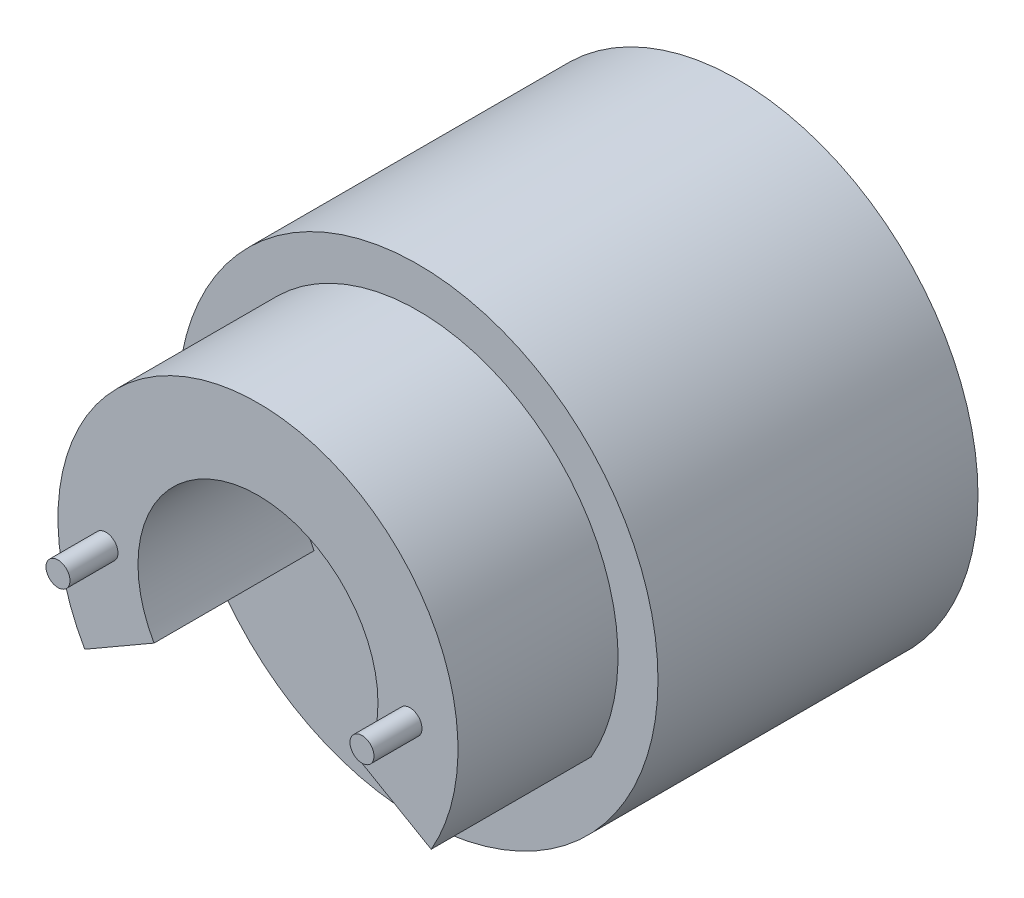
ISO-10303-21;
HEADER;
FILE_DESCRIPTION(('STEP AP214'),'2;1');
FILE_NAME('part.step','',(''),(''),'','','');
FILE_SCHEMA(('AUTOMOTIVE_DESIGN { 1 0 10303 214 1 1 1 1 }'));
ENDSEC;
DATA;
#1=APPLICATION_CONTEXT('core data for automotive mechanical design processes');
#2=APPLICATION_PROTOCOL_DEFINITION('international standard','automotive_design',2000,#1);
#3=PRODUCT_CONTEXT('',#1,'mechanical');
#4=PRODUCT('Part','Part','',(#3));
#5=PRODUCT_RELATED_PRODUCT_CATEGORY('part','',(#4));
#6=PRODUCT_DEFINITION_FORMATION('','',#4);
#7=PRODUCT_DEFINITION_CONTEXT('part definition',#1,'design');
#8=PRODUCT_DEFINITION('design','',#6,#7);
#9=PRODUCT_DEFINITION_SHAPE('','',#8);
#10=(LENGTH_UNIT() NAMED_UNIT(*) SI_UNIT(.MILLI.,.METRE.));
#11=(NAMED_UNIT(*) PLANE_ANGLE_UNIT() SI_UNIT($,.RADIAN.));
#12=(NAMED_UNIT(*) SI_UNIT($,.STERADIAN.) SOLID_ANGLE_UNIT());
#13=UNCERTAINTY_MEASURE_WITH_UNIT(LENGTH_MEASURE(1.E-05),#10,'distance_accuracy_value','');
#14=(GEOMETRIC_REPRESENTATION_CONTEXT(3) GLOBAL_UNCERTAINTY_ASSIGNED_CONTEXT((#13)) GLOBAL_UNIT_ASSIGNED_CONTEXT((#10,
#11,#12)) REPRESENTATION_CONTEXT('',''));
#15=CARTESIAN_POINT('',(0.,0.,0.));
#16=DIRECTION('',(0.,0.,1.));
#17=DIRECTION('',(1.,0.,0.));
#18=AXIS2_PLACEMENT_3D('',#15,#16,#17);
#19=CARTESIAN_POINT('',(0.,0.,20.));
#20=DIRECTION('',(0.,0.,1.));
#21=DIRECTION('',(1.,0.,0.));
#22=AXIS2_PLACEMENT_3D('',#19,#20,#21);
#23=PLANE('',#22);
#24=CARTESIAN_POINT('',(0.,0.,20.));
#25=DIRECTION('',(0.,0.,1.));
#26=DIRECTION('',(1.,0.,0.));
#27=AXIS2_PLACEMENT_3D('',#24,#25,#26);
#28=CIRCLE('',#27,15.);
#29=CARTESIAN_POINT('',(15.,0.,20.));
#30=VERTEX_POINT('',#29);
#31=EDGE_CURVE('E11',#30,#30,#28,.T.);
#32=ORIENTED_EDGE('',*,*,#31,.T.);
#33=EDGE_LOOP('',(#32));
#34=FACE_BOUND('',#33,.T.);
#35=DIRECTION('',(0.866025403784442,0.499999999999995,0.));
#36=VECTOR('',#35,1.);
#37=CARTESIAN_POINT('',(-6.49519052838331,-3.74999999999996,20.));
#38=LINE('',#37,#36);
#39=CARTESIAN_POINT('',(-10.8253175473055,-6.24999999999994,20.));
#40=VERTEX_POINT('',#39);
#41=CARTESIAN_POINT('',(-6.49519052838331,-3.74999999999996,20.));
#42=VERTEX_POINT('',#41);
#43=EDGE_CURVE('E95',#40,#42,#38,.T.);
#44=ORIENTED_EDGE('',*,*,#43,.F.);
#45=CARTESIAN_POINT('',(0.,0.,20.));
#46=DIRECTION('',(0.,0.,1.));
#47=DIRECTION('',(1.,0.,0.));
#48=AXIS2_PLACEMENT_3D('',#45,#46,#47);
#49=CIRCLE('',#48,12.5);
#50=CARTESIAN_POINT('',(10.8253175473055,-6.25000000000001,20.));
#51=VERTEX_POINT('',#50);
#52=EDGE_CURVE('E106',#51,#40,#49,.T.);
#53=ORIENTED_EDGE('',*,*,#52,.F.);
#54=DIRECTION('',(0.866025403784438,-0.500000000000001,0.));
#55=VECTOR('',#54,1.);
#56=CARTESIAN_POINT('',(6.49519052838329,-3.75000000000001,20.));
#57=LINE('',#56,#55);
#58=CARTESIAN_POINT('',(6.49519052838328,-3.75,20.));
#59=VERTEX_POINT('',#58);
#60=EDGE_CURVE('E76',#59,#51,#57,.T.);
#61=ORIENTED_EDGE('',*,*,#60,.F.);
#62=CARTESIAN_POINT('',(0.,0.,20.));
#63=DIRECTION('',(0.,0.,-1.));
#64=DIRECTION('',(1.,0.,0.));
#65=AXIS2_PLACEMENT_3D('',#62,#63,#64);
#66=CIRCLE('',#65,7.5);
#67=EDGE_CURVE('E111',#42,#59,#66,.T.);
#68=ORIENTED_EDGE('',*,*,#67,.F.);
#69=EDGE_LOOP('',(#44,#53,#61,#68));
#70=FACE_BOUND('',#69,.T.);
#71=ADVANCED_FACE('F39',(#34,#70),#23,.T.);
#72=CARTESIAN_POINT('',(0.,0.,20.));
#73=DIRECTION('',(0.,0.,-1.));
#74=DIRECTION('',(-1.,0.,0.));
#75=AXIS2_PLACEMENT_3D('',#72,#73,#74);
#76=CYLINDRICAL_SURFACE('',#75,15.);
#77=ORIENTED_EDGE('',*,*,#31,.F.);
#78=EDGE_LOOP('',(#77));
#79=FACE_BOUND('',#78,.T.);
#80=CARTESIAN_POINT('',(0.,0.,0.));
#81=DIRECTION('',(0.,0.,1.));
#82=DIRECTION('',(1.,0.,0.));
#83=AXIS2_PLACEMENT_3D('',#80,#81,#82);
#84=CIRCLE('',#83,15.);
#85=CARTESIAN_POINT('',(15.,0.,0.));
#86=VERTEX_POINT('',#85);
#87=EDGE_CURVE('E43',#86,#86,#84,.T.);
#88=ORIENTED_EDGE('',*,*,#87,.T.);
#89=EDGE_LOOP('',(#88));
#90=FACE_BOUND('',#89,.T.);
#91=ADVANCED_FACE('F41',(#79,#90),#76,.T.);
#92=CARTESIAN_POINT('',(0.,0.,0.));
#93=DIRECTION('',(0.,0.,1.));
#94=DIRECTION('',(1.,0.,0.));
#95=AXIS2_PLACEMENT_3D('',#92,#93,#94);
#96=PLANE('',#95);
#97=ORIENTED_EDGE('',*,*,#87,.F.);
#98=EDGE_LOOP('',(#97));
#99=FACE_BOUND('',#98,.T.);
#100=ADVANCED_FACE('F120',(#99),#96,.F.);
#101=CARTESIAN_POINT('',(0.,0.,30.));
#102=DIRECTION('',(0.,0.,-1.));
#103=DIRECTION('',(-1.,0.,0.));
#104=AXIS2_PLACEMENT_3D('',#101,#102,#103);
#105=CYLINDRICAL_SURFACE('',#104,12.5);
#106=ORIENTED_EDGE('',*,*,#52,.T.);
#107=DIRECTION('',(0.,0.,-1.));
#108=VECTOR('',#107,1.);
#109=CARTESIAN_POINT('',(-10.8253175473055,-6.24999999999994,30.));
#110=LINE('',#109,#108);
#111=CARTESIAN_POINT('',(-10.8253175473055,-6.24999999999994,30.));
#112=VERTEX_POINT('',#111);
#113=EDGE_CURVE('E98',#112,#40,#110,.T.);
#114=ORIENTED_EDGE('',*,*,#113,.F.);
#115=CARTESIAN_POINT('',(0.,0.,30.));
#116=DIRECTION('',(0.,0.,1.));
#117=DIRECTION('',(1.,0.,0.));
#118=AXIS2_PLACEMENT_3D('',#115,#116,#117);
#119=CIRCLE('',#118,12.5);
#120=CARTESIAN_POINT('',(10.8253175473055,-6.25000000000001,30.));
#121=VERTEX_POINT('',#120);
#122=EDGE_CURVE('E88',#121,#112,#119,.T.);
#123=ORIENTED_EDGE('',*,*,#122,.F.);
#124=DIRECTION('',(0.,0.,-1.));
#125=VECTOR('',#124,1.);
#126=CARTESIAN_POINT('',(10.8253175473055,-6.25000000000001,30.));
#127=LINE('',#126,#125);
#128=EDGE_CURVE('E102',#121,#51,#127,.T.);
#129=ORIENTED_EDGE('',*,*,#128,.T.);
#130=EDGE_LOOP('',(#106,#114,#123,#129));
#131=FACE_BOUND('',#130,.T.);
#132=ADVANCED_FACE('F122',(#131),#105,.T.);
#133=CARTESIAN_POINT('',(-6.49519052838331,-3.74999999999996,30.));
#134=DIRECTION('',(-0.499999999999995,0.866025403784442,0.));
#135=DIRECTION('',(-0.866025403784442,-0.499999999999995,0.));
#136=AXIS2_PLACEMENT_3D('',#133,#134,#135);
#137=PLANE('',#136);
#138=ORIENTED_EDGE('',*,*,#43,.T.);
#139=DIRECTION('',(0.,0.,-1.));
#140=VECTOR('',#139,1.);
#141=CARTESIAN_POINT('',(-6.49519052838331,-3.74999999999996,30.));
#142=LINE('',#141,#140);
#143=CARTESIAN_POINT('',(-6.49519052838331,-3.74999999999996,30.));
#144=VERTEX_POINT('',#143);
#145=EDGE_CURVE('E92',#144,#42,#142,.T.);
#146=ORIENTED_EDGE('',*,*,#145,.F.);
#147=DIRECTION('',(0.866025403784442,0.499999999999995,0.));
#148=VECTOR('',#147,1.);
#149=CARTESIAN_POINT('',(-6.49519052838331,-3.74999999999996,30.));
#150=LINE('',#149,#148);
#151=EDGE_CURVE('E83',#112,#144,#150,.T.);
#152=ORIENTED_EDGE('',*,*,#151,.F.);
#153=ORIENTED_EDGE('',*,*,#113,.T.);
#154=EDGE_LOOP('',(#138,#146,#152,#153));
#155=FACE_BOUND('',#154,.T.);
#156=ADVANCED_FACE('F93',(#155),#137,.F.);
#157=CARTESIAN_POINT('',(0.,0.,30.));
#158=DIRECTION('',(0.,0.,-1.));
#159=DIRECTION('',(-1.,0.,0.));
#160=AXIS2_PLACEMENT_3D('',#157,#158,#159);
#161=CYLINDRICAL_SURFACE('',#160,7.5);
#162=ORIENTED_EDGE('',*,*,#67,.T.);
#163=DIRECTION('',(0.,0.,-1.));
#164=VECTOR('',#163,1.);
#165=CARTESIAN_POINT('',(6.49519052838328,-3.75000000000001,30.));
#166=LINE('',#165,#164);
#167=CARTESIAN_POINT('',(6.49519052838328,-3.75000000000001,30.));
#168=VERTEX_POINT('',#167);
#169=EDGE_CURVE('E54',#168,#59,#166,.T.);
#170=ORIENTED_EDGE('',*,*,#169,.F.);
#171=CARTESIAN_POINT('',(0.,0.,30.));
#172=DIRECTION('',(0.,0.,-1.));
#173=DIRECTION('',(1.,0.,0.));
#174=AXIS2_PLACEMENT_3D('',#171,#172,#173);
#175=CIRCLE('',#174,7.5);
#176=EDGE_CURVE('E86',#144,#168,#175,.T.);
#177=ORIENTED_EDGE('',*,*,#176,.F.);
#178=ORIENTED_EDGE('',*,*,#145,.T.);
#179=EDGE_LOOP('',(#162,#170,#177,#178));
#180=FACE_BOUND('',#179,.T.);
#181=ADVANCED_FACE('F100',(#180),#161,.F.);
#182=CARTESIAN_POINT('',(6.49519052838329,-3.75000000000001,30.));
#183=DIRECTION('',(0.500000000000001,0.866025403784438,0.));
#184=DIRECTION('',(-0.866025403784438,0.500000000000001,0.));
#185=AXIS2_PLACEMENT_3D('',#182,#183,#184);
#186=PLANE('',#185);
#187=ORIENTED_EDGE('',*,*,#60,.T.);
#188=ORIENTED_EDGE('',*,*,#128,.F.);
#189=DIRECTION('',(0.866025403784438,-0.500000000000001,0.));
#190=VECTOR('',#189,1.);
#191=CARTESIAN_POINT('',(6.49519052838329,-3.75000000000001,30.));
#192=LINE('',#191,#190);
#193=EDGE_CURVE('E62',#168,#121,#192,.T.);
#194=ORIENTED_EDGE('',*,*,#193,.F.);
#195=ORIENTED_EDGE('',*,*,#169,.T.);
#196=EDGE_LOOP('',(#187,#188,#194,#195));
#197=FACE_BOUND('',#196,.T.);
#198=ADVANCED_FACE('F141',(#197),#186,.F.);
#199=CARTESIAN_POINT('',(0.,0.,30.));
#200=DIRECTION('',(0.,0.,1.));
#201=DIRECTION('',(1.,0.,0.));
#202=AXIS2_PLACEMENT_3D('',#199,#200,#201);
#203=PLANE('',#202);
#204=CARTESIAN_POINT('',(9.5,0.,30.));
#205=DIRECTION('',(0.,0.,1.));
#206=DIRECTION('',(1.,0.,0.));
#207=AXIS2_PLACEMENT_3D('',#204,#205,#206);
#208=CIRCLE('',#207,0.75);
#209=CARTESIAN_POINT('',(10.25,0.,30.));
#210=VERTEX_POINT('',#209);
#211=EDGE_CURVE('E166',#210,#210,#208,.T.);
#212=ORIENTED_EDGE('',*,*,#211,.F.);
#213=EDGE_LOOP('',(#212));
#214=FACE_BOUND('',#213,.T.);
#215=CARTESIAN_POINT('',(-9.5,0.,30.));
#216=DIRECTION('',(0.,0.,1.));
#217=DIRECTION('',(1.,0.,0.));
#218=AXIS2_PLACEMENT_3D('',#215,#216,#217);
#219=CIRCLE('',#218,0.75);
#220=CARTESIAN_POINT('',(-8.75,0.,30.));
#221=VERTEX_POINT('',#220);
#222=EDGE_CURVE('E169',#221,#221,#219,.T.);
#223=ORIENTED_EDGE('',*,*,#222,.F.);
#224=EDGE_LOOP('',(#223));
#225=FACE_BOUND('',#224,.T.);
#226=ORIENTED_EDGE('',*,*,#122,.T.);
#227=ORIENTED_EDGE('',*,*,#151,.T.);
#228=ORIENTED_EDGE('',*,*,#176,.T.);
#229=ORIENTED_EDGE('',*,*,#193,.T.);
#230=EDGE_LOOP('',(#226,#227,#228,#229));
#231=FACE_BOUND('',#230,.T.);
#232=ADVANCED_FACE('F84',(#214,#225,#231),#203,.T.);
#233=CARTESIAN_POINT('',(-9.5,0.,33.));
#234=DIRECTION('',(0.,0.,-1.));
#235=DIRECTION('',(-1.,0.,0.));
#236=AXIS2_PLACEMENT_3D('',#233,#234,#235);
#237=CYLINDRICAL_SURFACE('',#236,0.75);
#238=CARTESIAN_POINT('',(-9.5,0.,33.));
#239=DIRECTION('',(0.,0.,1.));
#240=DIRECTION('',(1.,0.,0.));
#241=AXIS2_PLACEMENT_3D('',#238,#239,#240);
#242=CIRCLE('',#241,0.75);
#243=CARTESIAN_POINT('',(-8.75,0.,33.));
#244=VERTEX_POINT('',#243);
#245=EDGE_CURVE('E174',#244,#244,#242,.T.);
#246=ORIENTED_EDGE('',*,*,#245,.F.);
#247=EDGE_LOOP('',(#246));
#248=FACE_BOUND('',#247,.T.);
#249=ORIENTED_EDGE('',*,*,#222,.T.);
#250=EDGE_LOOP('',(#249));
#251=FACE_BOUND('',#250,.T.);
#252=ADVANCED_FACE('F146',(#248,#251),#237,.T.);
#253=CARTESIAN_POINT('',(-9.5,0.,33.));
#254=DIRECTION('',(0.,0.,1.));
#255=DIRECTION('',(1.,0.,0.));
#256=AXIS2_PLACEMENT_3D('',#253,#254,#255);
#257=PLANE('',#256);
#258=ORIENTED_EDGE('',*,*,#245,.T.);
#259=EDGE_LOOP('',(#258));
#260=FACE_BOUND('',#259,.T.);
#261=ADVANCED_FACE('F148',(#260),#257,.T.);
#262=CARTESIAN_POINT('',(9.5,0.,33.));
#263=DIRECTION('',(0.,0.,-1.));
#264=DIRECTION('',(-1.,0.,0.));
#265=AXIS2_PLACEMENT_3D('',#262,#263,#264);
#266=CYLINDRICAL_SURFACE('',#265,0.75);
#267=CARTESIAN_POINT('',(9.5,0.,33.));
#268=DIRECTION('',(0.,0.,1.));
#269=DIRECTION('',(1.,0.,0.));
#270=AXIS2_PLACEMENT_3D('',#267,#268,#269);
#271=CIRCLE('',#270,0.75);
#272=CARTESIAN_POINT('',(10.25,0.,33.));
#273=VERTEX_POINT('',#272);
#274=EDGE_CURVE('E109',#273,#273,#271,.T.);
#275=ORIENTED_EDGE('',*,*,#274,.F.);
#276=EDGE_LOOP('',(#275));
#277=FACE_BOUND('',#276,.T.);
#278=ORIENTED_EDGE('',*,*,#211,.T.);
#279=EDGE_LOOP('',(#278));
#280=FACE_BOUND('',#279,.T.);
#281=ADVANCED_FACE('F151',(#277,#280),#266,.T.);
#282=CARTESIAN_POINT('',(9.5,0.,33.));
#283=DIRECTION('',(0.,0.,1.));
#284=DIRECTION('',(1.,0.,0.));
#285=AXIS2_PLACEMENT_3D('',#282,#283,#284);
#286=PLANE('',#285);
#287=ORIENTED_EDGE('',*,*,#274,.T.);
#288=EDGE_LOOP('',(#287));
#289=FACE_BOUND('',#288,.T.);
#290=ADVANCED_FACE('F158',(#289),#286,.T.);
#291=CLOSED_SHELL('',(#71,#91,#100,#132,#156,#181,#198,#232,#252,#261,#281,#290));
#292=MANIFOLD_SOLID_BREP('B2',#291);
#293=ADVANCED_BREP_SHAPE_REPRESENTATION('',(#18,#292),#14);
#294=SHAPE_DEFINITION_REPRESENTATION(#9,#293);
ENDSEC;
END-ISO-10303-21;
